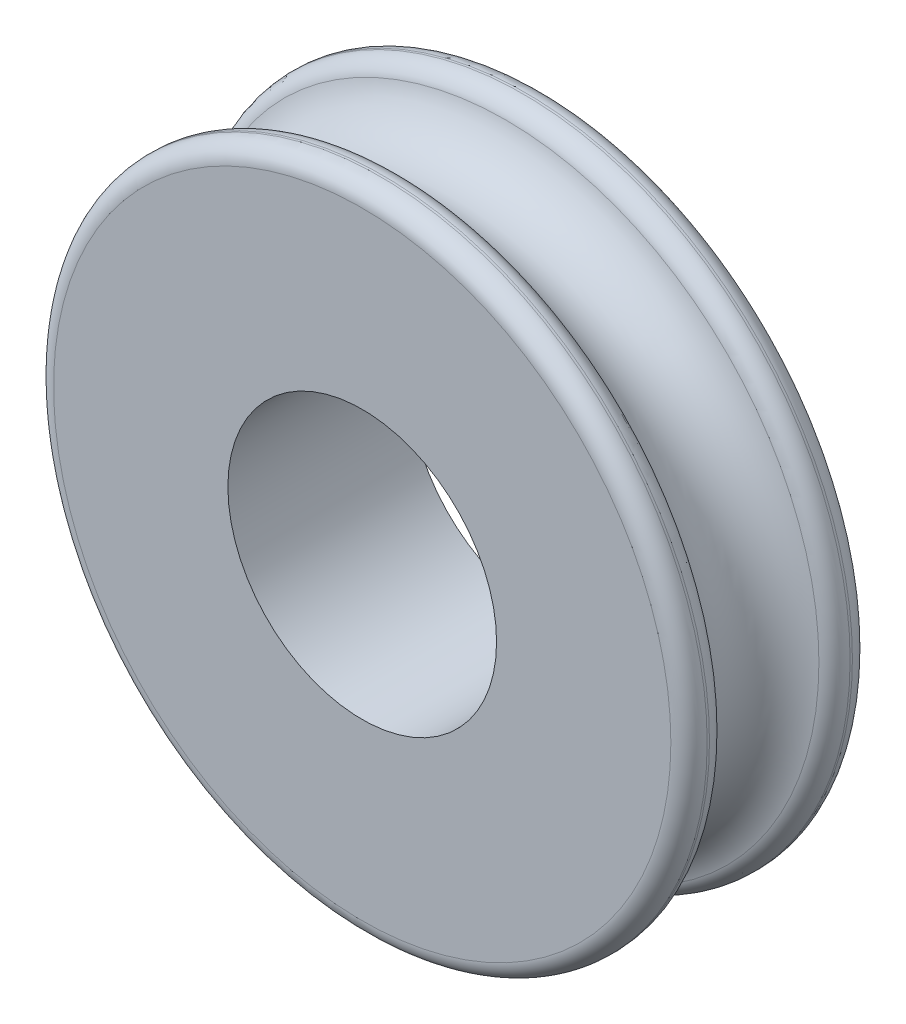
ISO-10303-21;
HEADER;
FILE_DESCRIPTION(('STEP AP214'),'2;1');
FILE_NAME('part.step','',(''),(''),'','','');
FILE_SCHEMA(('AUTOMOTIVE_DESIGN { 1 0 10303 214 1 1 1 1 }'));
ENDSEC;
DATA;
#1=APPLICATION_CONTEXT('core data for automotive mechanical design processes');
#2=APPLICATION_PROTOCOL_DEFINITION('international standard','automotive_design',2000,#1);
#3=PRODUCT_CONTEXT('',#1,'mechanical');
#4=PRODUCT('Part','Part','',(#3));
#5=PRODUCT_RELATED_PRODUCT_CATEGORY('part','',(#4));
#6=PRODUCT_DEFINITION_FORMATION('','',#4);
#7=PRODUCT_DEFINITION_CONTEXT('part definition',#1,'design');
#8=PRODUCT_DEFINITION('design','',#6,#7);
#9=PRODUCT_DEFINITION_SHAPE('','',#8);
#10=(LENGTH_UNIT() NAMED_UNIT(*) SI_UNIT(.MILLI.,.METRE.));
#11=(NAMED_UNIT(*) PLANE_ANGLE_UNIT() SI_UNIT($,.RADIAN.));
#12=(NAMED_UNIT(*) SI_UNIT($,.STERADIAN.) SOLID_ANGLE_UNIT());
#13=UNCERTAINTY_MEASURE_WITH_UNIT(LENGTH_MEASURE(1.E-05),#10,'distance_accuracy_value','');
#14=(GEOMETRIC_REPRESENTATION_CONTEXT(3) GLOBAL_UNCERTAINTY_ASSIGNED_CONTEXT((#13)) GLOBAL_UNIT_ASSIGNED_CONTEXT((#10,
#11,#12)) REPRESENTATION_CONTEXT('',''));
#15=CARTESIAN_POINT('',(0.,0.,0.));
#16=DIRECTION('',(0.,0.,1.));
#17=DIRECTION('',(1.,0.,0.));
#18=AXIS2_PLACEMENT_3D('',#15,#16,#17);
#19=CARTESIAN_POINT('',(0.,0.,2.5));
#20=DIRECTION('',(0.,0.,-1.));
#21=DIRECTION('',(-1.,0.,0.));
#22=AXIS2_PLACEMENT_3D('',#19,#20,#21);
#23=CYLINDRICAL_SURFACE('',#22,9.);
#24=CARTESIAN_POINT('',(0.,0.,1.93649167310371));
#25=DIRECTION('',(0.,0.,-1.));
#26=DIRECTION('',(-1.,0.,0.));
#27=AXIS2_PLACEMENT_3D('',#24,#25,#26);
#28=CIRCLE('',#27,9.);
#29=CARTESIAN_POINT('',(9.,0.,1.93649167310371));
#30=VERTEX_POINT('',#29);
#31=EDGE_CURVE('E69',#30,#30,#28,.F.);
#32=ORIENTED_EDGE('',*,*,#31,.T.);
#33=EDGE_LOOP('',(#32));
#34=FACE_BOUND('',#33,.T.);
#35=CARTESIAN_POINT('',(0.,0.,2.));
#36=DIRECTION('',(0.,0.,1.));
#37=DIRECTION('',(1.,0.,0.));
#38=AXIS2_PLACEMENT_3D('',#35,#36,#37);
#39=CIRCLE('',#38,9.);
#40=CARTESIAN_POINT('',(9.,0.,2.));
#41=VERTEX_POINT('',#40);
#42=EDGE_CURVE('E95',#41,#41,#39,.F.);
#43=ORIENTED_EDGE('',*,*,#42,.T.);
#44=EDGE_LOOP('',(#43));
#45=FACE_BOUND('',#44,.T.);
#46=ADVANCED_FACE('F39',(#34,#45),#23,.T.);
#47=CARTESIAN_POINT('',(0.,0.,2.5));
#48=DIRECTION('',(0.,0.,1.));
#49=DIRECTION('',(1.,0.,0.));
#50=AXIS2_PLACEMENT_3D('',#47,#48,#49);
#51=PLANE('',#50);
#52=CARTESIAN_POINT('',(0.,0.,2.5));
#53=DIRECTION('',(0.,0.,1.));
#54=DIRECTION('',(1.,0.,0.));
#55=AXIS2_PLACEMENT_3D('',#52,#53,#54);
#56=CIRCLE('',#55,8.5);
#57=CARTESIAN_POINT('',(8.5,0.,2.5));
#58=VERTEX_POINT('',#57);
#59=EDGE_CURVE('E99',#58,#58,#56,.T.);
#60=ORIENTED_EDGE('',*,*,#59,.T.);
#61=EDGE_LOOP('',(#60));
#62=FACE_BOUND('',#61,.T.);
#63=CARTESIAN_POINT('',(0.,0.,2.5));
#64=DIRECTION('',(0.,0.,1.));
#65=DIRECTION('',(1.,0.,0.));
#66=AXIS2_PLACEMENT_3D('',#63,#64,#65);
#67=CIRCLE('',#66,3.7);
#68=CARTESIAN_POINT('',(3.7,0.,2.5));
#69=VERTEX_POINT('',#68);
#70=EDGE_CURVE('E103',#69,#69,#67,.T.);
#71=ORIENTED_EDGE('',*,*,#70,.F.);
#72=EDGE_LOOP('',(#71));
#73=FACE_BOUND('',#72,.T.);
#74=ADVANCED_FACE('F114',(#62,#73),#51,.T.);
#75=CARTESIAN_POINT('',(0.,0.,-2.5));
#76=DIRECTION('',(0.,0.,1.));
#77=DIRECTION('',(1.,0.,0.));
#78=AXIS2_PLACEMENT_3D('',#75,#76,#77);
#79=PLANE('',#78);
#80=CARTESIAN_POINT('',(0.,0.,-2.5));
#81=DIRECTION('',(0.,0.,1.));
#82=DIRECTION('',(1.,0.,0.));
#83=AXIS2_PLACEMENT_3D('',#80,#81,#82);
#84=CIRCLE('',#83,8.5);
#85=CARTESIAN_POINT('',(8.5,0.,-2.5));
#86=VERTEX_POINT('',#85);
#87=EDGE_CURVE('E87',#86,#86,#84,.F.);
#88=ORIENTED_EDGE('',*,*,#87,.T.);
#89=EDGE_LOOP('',(#88));
#90=FACE_BOUND('',#89,.T.);
#91=CARTESIAN_POINT('',(0.,0.,-2.5));
#92=DIRECTION('',(0.,0.,1.));
#93=DIRECTION('',(1.,0.,0.));
#94=AXIS2_PLACEMENT_3D('',#91,#92,#93);
#95=CIRCLE('',#94,3.7);
#96=CARTESIAN_POINT('',(3.7,0.,-2.5));
#97=VERTEX_POINT('',#96);
#98=EDGE_CURVE('E76',#97,#97,#95,.T.);
#99=ORIENTED_EDGE('',*,*,#98,.T.);
#100=EDGE_LOOP('',(#99));
#101=FACE_BOUND('',#100,.T.);
#102=ADVANCED_FACE('F116',(#90,#101),#79,.F.);
#103=CARTESIAN_POINT('',(0.,0.,-1.93649167310371));
#104=DIRECTION('',(0.,0.,1.));
#105=DIRECTION('',(1.,0.,0.));
#106=AXIS2_PLACEMENT_3D('',#103,#104,#105);
#107=CIRCLE('',#106,9.);
#108=CARTESIAN_POINT('',(9.,0.,-1.93649167310371));
#109=VERTEX_POINT('',#108);
#110=EDGE_CURVE('E11',#109,#109,#107,.F.);
#111=ORIENTED_EDGE('',*,*,#110,.T.);
#112=EDGE_LOOP('',(#111));
#113=FACE_BOUND('',#112,.T.);
#114=CARTESIAN_POINT('',(0.,0.,-2.));
#115=DIRECTION('',(0.,0.,1.));
#116=DIRECTION('',(1.,0.,0.));
#117=AXIS2_PLACEMENT_3D('',#114,#115,#116);
#118=CIRCLE('',#117,9.);
#119=CARTESIAN_POINT('',(9.,0.,-2.));
#120=VERTEX_POINT('',#119);
#121=EDGE_CURVE('E91',#120,#120,#118,.T.);
#122=ORIENTED_EDGE('',*,*,#121,.T.);
#123=EDGE_LOOP('',(#122));
#124=FACE_BOUND('',#123,.T.);
#125=ADVANCED_FACE('F123',(#113,#124),#23,.T.);
#126=CARTESIAN_POINT('',(0.,0.,2.5));
#127=DIRECTION('',(0.,0.,-1.));
#128=DIRECTION('',(-1.,0.,0.));
#129=AXIS2_PLACEMENT_3D('',#126,#127,#128);
#130=CYLINDRICAL_SURFACE('',#129,3.7);
#131=ORIENTED_EDGE('',*,*,#70,.T.);
#132=EDGE_LOOP('',(#131));
#133=FACE_BOUND('',#132,.T.);
#134=ORIENTED_EDGE('',*,*,#98,.F.);
#135=EDGE_LOOP('',(#134));
#136=FACE_BOUND('',#135,.T.);
#137=ADVANCED_FACE('F111',(#133,#136),#130,.F.);
#138=CARTESIAN_POINT('',(0.,0.,0.));
#139=DIRECTION('',(0.,0.,1.));
#140=DIRECTION('',(1.,0.,0.));
#141=AXIS2_PLACEMENT_3D('',#138,#139,#140);
#142=TOROIDAL_SURFACE('',#141,9.,1.5);
#143=CARTESIAN_POINT('',(9.,0.,0.));
#144=DIRECTION('',(0.,1.,0.));
#145=DIRECTION('',(0.,0.,1.));
#146=AXIS2_PLACEMENT_3D('',#143,#144,#145);
#147=CIRCLE('',#146,1.5);
#148=CARTESIAN_POINT('',(8.62500000000016,0.,-1.45236875482787));
#149=VERTEX_POINT('',#148);
#150=CARTESIAN_POINT('',(8.62500000000005,0.,1.45236875482781));
#151=VERTEX_POINT('',#150);
#152=EDGE_CURVE('E72',#149,#151,#147,.T.);
#153=ORIENTED_EDGE('',*,*,#152,.T.);
#154=CARTESIAN_POINT('',(0.,0.,1.45236875482781));
#155=DIRECTION('',(0.,0.,-1.));
#156=DIRECTION('',(-1.,0.,0.));
#157=AXIS2_PLACEMENT_3D('',#154,#155,#156);
#158=CIRCLE('',#157,8.62499999999999);
#159=EDGE_CURVE('E49',#151,#151,#158,.T.);
#160=ORIENTED_EDGE('',*,*,#159,.T.);
#161=ORIENTED_EDGE('',*,*,#152,.F.);
#162=CARTESIAN_POINT('',(0.,0.,-1.45236875482787));
#163=DIRECTION('',(0.,0.,1.));
#164=DIRECTION('',(1.,0.,0.));
#165=AXIS2_PLACEMENT_3D('',#162,#163,#164);
#166=CIRCLE('',#165,8.62499999999998);
#167=EDGE_CURVE('E81',#149,#149,#166,.T.);
#168=ORIENTED_EDGE('',*,*,#167,.T.);
#169=EDGE_LOOP('',(#153,#160,#161,#168));
#170=FACE_BOUND('',#169,.T.);
#171=ADVANCED_FACE('F137',(#170),#142,.F.);
#172=CARTESIAN_POINT('',(0.,0.,2.));
#173=DIRECTION('',(0.,0.,1.));
#174=DIRECTION('',(1.,0.,0.));
#175=AXIS2_PLACEMENT_3D('',#172,#173,#174);
#176=TOROIDAL_SURFACE('',#175,8.5,0.5);
#177=ORIENTED_EDGE('',*,*,#42,.F.);
#178=EDGE_LOOP('',(#177));
#179=FACE_BOUND('',#178,.T.);
#180=ORIENTED_EDGE('',*,*,#59,.F.);
#181=EDGE_LOOP('',(#180));
#182=FACE_BOUND('',#181,.T.);
#183=ADVANCED_FACE('F133',(#179,#182),#176,.T.);
#184=CARTESIAN_POINT('',(0.,0.,-2.));
#185=DIRECTION('',(0.,0.,1.));
#186=DIRECTION('',(1.,0.,0.));
#187=AXIS2_PLACEMENT_3D('',#184,#185,#186);
#188=TOROIDAL_SURFACE('',#187,8.5,0.5);
#189=ORIENTED_EDGE('',*,*,#87,.F.);
#190=EDGE_LOOP('',(#189));
#191=FACE_BOUND('',#190,.T.);
#192=ORIENTED_EDGE('',*,*,#121,.F.);
#193=EDGE_LOOP('',(#192));
#194=FACE_BOUND('',#193,.T.);
#195=ADVANCED_FACE('F136',(#191,#194),#188,.T.);
#196=CARTESIAN_POINT('',(0.,0.,1.93649167310371));
#197=DIRECTION('',(0.,0.,-1.));
#198=DIRECTION('',(-1.,0.,0.));
#199=AXIS2_PLACEMENT_3D('',#196,#197,#198);
#200=TOROIDAL_SURFACE('',#199,8.5,0.5);
#201=CARTESIAN_POINT('',(8.5,0.,1.93649167310371));
#202=DIRECTION('',(0.,-1.,0.));
#203=DIRECTION('',(0.,0.,-1.));
#204=AXIS2_PLACEMENT_3D('',#201,#202,#203);
#205=CIRCLE('',#204,0.5);
#206=EDGE_CURVE('E63',#151,#30,#205,.T.);
#207=ORIENTED_EDGE('',*,*,#206,.F.);
#208=ORIENTED_EDGE('',*,*,#159,.F.);
#209=ORIENTED_EDGE('',*,*,#206,.T.);
#210=ORIENTED_EDGE('',*,*,#31,.F.);
#211=EDGE_LOOP('',(#207,#208,#209,#210));
#212=FACE_BOUND('',#211,.T.);
#213=ADVANCED_FACE('F67',(#212),#200,.T.);
#214=CARTESIAN_POINT('',(0.,0.,-1.93649167310371));
#215=DIRECTION('',(0.,0.,1.));
#216=DIRECTION('',(1.,0.,0.));
#217=AXIS2_PLACEMENT_3D('',#214,#215,#216);
#218=TOROIDAL_SURFACE('',#217,8.5,0.5);
#219=CARTESIAN_POINT('',(8.5,0.,-1.93649167310371));
#220=DIRECTION('',(0.,1.,0.));
#221=DIRECTION('',(0.,0.,1.));
#222=AXIS2_PLACEMENT_3D('',#219,#220,#221);
#223=CIRCLE('',#222,0.5);
#224=EDGE_CURVE('E43',#149,#109,#223,.T.);
#225=ORIENTED_EDGE('',*,*,#224,.F.);
#226=ORIENTED_EDGE('',*,*,#167,.F.);
#227=ORIENTED_EDGE('',*,*,#224,.T.);
#228=ORIENTED_EDGE('',*,*,#110,.F.);
#229=EDGE_LOOP('',(#225,#226,#227,#228));
#230=FACE_BOUND('',#229,.T.);
#231=ADVANCED_FACE('F41',(#230),#218,.T.);
#232=CLOSED_SHELL('',(#46,#74,#102,#125,#137,#171,#183,#195,#213,#231));
#233=MANIFOLD_SOLID_BREP('B2',#232);
#234=ADVANCED_BREP_SHAPE_REPRESENTATION('',(#18,#233),#14);
#235=SHAPE_DEFINITION_REPRESENTATION(#9,#234);
ENDSEC;
END-ISO-10303-21;
